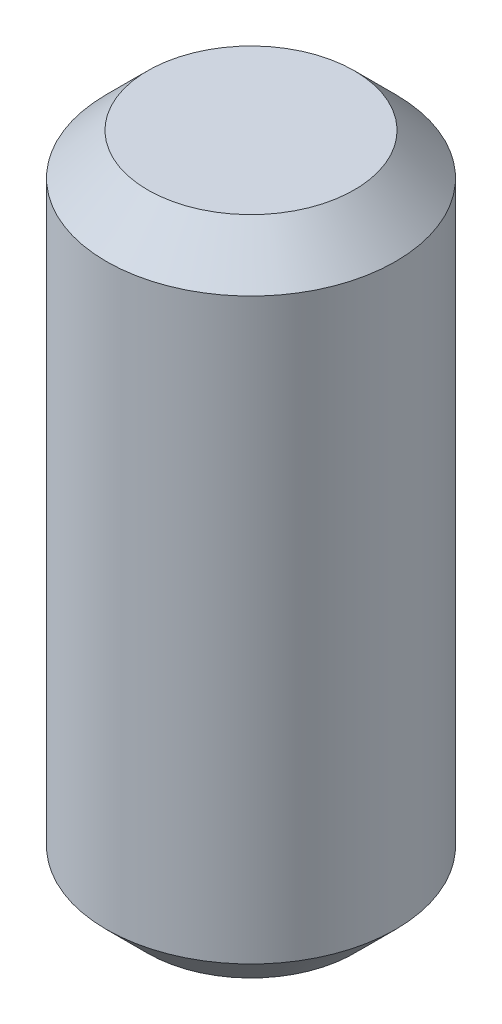
ISO-10303-21;
HEADER;
FILE_DESCRIPTION(('STEP AP214'),'2;1');
FILE_NAME('part.step','',(''),(''),'','','');
FILE_SCHEMA(('AUTOMOTIVE_DESIGN { 1 0 10303 214 1 1 1 1 }'));
ENDSEC;
DATA;
#1=APPLICATION_CONTEXT('core data for automotive mechanical design processes');
#2=APPLICATION_PROTOCOL_DEFINITION('international standard','automotive_design',2000,#1);
#3=PRODUCT_CONTEXT('',#1,'mechanical');
#4=PRODUCT('Part','Part','',(#3));
#5=PRODUCT_RELATED_PRODUCT_CATEGORY('part','',(#4));
#6=PRODUCT_DEFINITION_FORMATION('','',#4);
#7=PRODUCT_DEFINITION_CONTEXT('part definition',#1,'design');
#8=PRODUCT_DEFINITION('design','',#6,#7);
#9=PRODUCT_DEFINITION_SHAPE('','',#8);
#10=(LENGTH_UNIT() NAMED_UNIT(*) SI_UNIT(.MILLI.,.METRE.));
#11=(NAMED_UNIT(*) PLANE_ANGLE_UNIT() SI_UNIT($,.RADIAN.));
#12=(NAMED_UNIT(*) SI_UNIT($,.STERADIAN.) SOLID_ANGLE_UNIT());
#13=UNCERTAINTY_MEASURE_WITH_UNIT(LENGTH_MEASURE(1.E-05),#10,'distance_accuracy_value','');
#14=(GEOMETRIC_REPRESENTATION_CONTEXT(3) GLOBAL_UNCERTAINTY_ASSIGNED_CONTEXT((#13)) GLOBAL_UNIT_ASSIGNED_CONTEXT((#10,
#11,#12)) REPRESENTATION_CONTEXT('',''));
#15=CARTESIAN_POINT('',(0.,0.,0.));
#16=DIRECTION('',(0.,0.,1.));
#17=DIRECTION('',(1.,0.,0.));
#18=AXIS2_PLACEMENT_3D('',#15,#16,#17);
#19=CARTESIAN_POINT('',(0.,-8.,0.));
#20=DIRECTION('',(0.,1.,0.));
#21=DIRECTION('',(0.,0.,1.));
#22=AXIS2_PLACEMENT_3D('',#19,#20,#21);
#23=CYLINDRICAL_SURFACE('',#22,1.75);
#24=CARTESIAN_POINT('',(0.,-7.5,0.));
#25=DIRECTION('',(0.,1.,0.));
#26=DIRECTION('',(0.,0.,1.));
#27=AXIS2_PLACEMENT_3D('',#24,#25,#26);
#28=CIRCLE('',#27,1.75);
#29=CARTESIAN_POINT('',(0.,-7.5,1.75));
#30=VERTEX_POINT('',#29);
#31=EDGE_CURVE('E42',#30,#30,#28,.T.);
#32=ORIENTED_EDGE('',*,*,#31,.T.);
#33=EDGE_LOOP('',(#32));
#34=FACE_BOUND('',#33,.T.);
#35=CARTESIAN_POINT('',(0.,-0.5,0.));
#36=DIRECTION('',(0.,1.,0.));
#37=DIRECTION('',(0.,0.,1.));
#38=AXIS2_PLACEMENT_3D('',#35,#36,#37);
#39=CIRCLE('',#38,1.75);
#40=CARTESIAN_POINT('',(0.,-0.5,1.75));
#41=VERTEX_POINT('',#40);
#42=EDGE_CURVE('E46',#41,#41,#39,.F.);
#43=ORIENTED_EDGE('',*,*,#42,.T.);
#44=EDGE_LOOP('',(#43));
#45=FACE_BOUND('',#44,.T.);
#46=ADVANCED_FACE('F31',(#34,#45),#23,.T.);
#47=CARTESIAN_POINT('',(0.,-8.,0.));
#48=DIRECTION('',(0.,1.,0.));
#49=DIRECTION('',(0.,0.,1.));
#50=AXIS2_PLACEMENT_3D('',#47,#48,#49);
#51=PLANE('',#50);
#52=CARTESIAN_POINT('',(0.,-8.,0.));
#53=DIRECTION('',(0.,1.,0.));
#54=DIRECTION('',(0.,0.,1.));
#55=AXIS2_PLACEMENT_3D('',#52,#53,#54);
#56=CIRCLE('',#55,1.25);
#57=CARTESIAN_POINT('',(0.,-8.,1.25));
#58=VERTEX_POINT('',#57);
#59=EDGE_CURVE('E38',#58,#58,#56,.F.);
#60=ORIENTED_EDGE('',*,*,#59,.T.);
#61=EDGE_LOOP('',(#60));
#62=FACE_BOUND('',#61,.T.);
#63=ADVANCED_FACE('F62',(#62),#51,.F.);
#64=CARTESIAN_POINT('',(0.,0.,0.));
#65=DIRECTION('',(0.,1.,0.));
#66=DIRECTION('',(0.,0.,1.));
#67=AXIS2_PLACEMENT_3D('',#64,#65,#66);
#68=PLANE('',#67);
#69=CARTESIAN_POINT('',(0.,0.,0.));
#70=DIRECTION('',(0.,1.,0.));
#71=DIRECTION('',(0.,0.,1.));
#72=AXIS2_PLACEMENT_3D('',#69,#70,#71);
#73=CIRCLE('',#72,1.25);
#74=CARTESIAN_POINT('',(0.,0.,1.25));
#75=VERTEX_POINT('',#74);
#76=EDGE_CURVE('E10',#75,#75,#73,.T.);
#77=ORIENTED_EDGE('',*,*,#76,.T.);
#78=EDGE_LOOP('',(#77));
#79=FACE_BOUND('',#78,.T.);
#80=ADVANCED_FACE('F59',(#79),#68,.T.);
#81=CARTESIAN_POINT('',(0.,-7.5,0.));
#82=DIRECTION('',(0.,1.,0.));
#83=DIRECTION('',(0.,0.,1.));
#84=AXIS2_PLACEMENT_3D('',#81,#82,#83);
#85=CONICAL_SURFACE('',#84,1.75,0.785398163397451);
#86=ORIENTED_EDGE('',*,*,#59,.F.);
#87=EDGE_LOOP('',(#86));
#88=FACE_BOUND('',#87,.T.);
#89=ORIENTED_EDGE('',*,*,#31,.F.);
#90=EDGE_LOOP('',(#89));
#91=FACE_BOUND('',#90,.T.);
#92=ADVANCED_FACE('F55',(#88,#91),#85,.T.);
#93=CARTESIAN_POINT('',(0.,0.,0.));
#94=DIRECTION('',(0.,-1.,0.));
#95=DIRECTION('',(0.,0.,-1.));
#96=AXIS2_PLACEMENT_3D('',#93,#94,#95);
#97=CONICAL_SURFACE('',#96,1.25,0.785398163397447);
#98=ORIENTED_EDGE('',*,*,#42,.F.);
#99=EDGE_LOOP('',(#98));
#100=FACE_BOUND('',#99,.T.);
#101=ORIENTED_EDGE('',*,*,#76,.F.);
#102=EDGE_LOOP('',(#101));
#103=FACE_BOUND('',#102,.T.);
#104=ADVANCED_FACE('F33',(#100,#103),#97,.T.);
#105=CLOSED_SHELL('',(#46,#63,#80,#92,#104));
#106=MANIFOLD_SOLID_BREP('B2',#105);
#107=ADVANCED_BREP_SHAPE_REPRESENTATION('',(#18,#106),#14);
#108=SHAPE_DEFINITION_REPRESENTATION(#9,#107);
ENDSEC;
END-ISO-10303-21;
